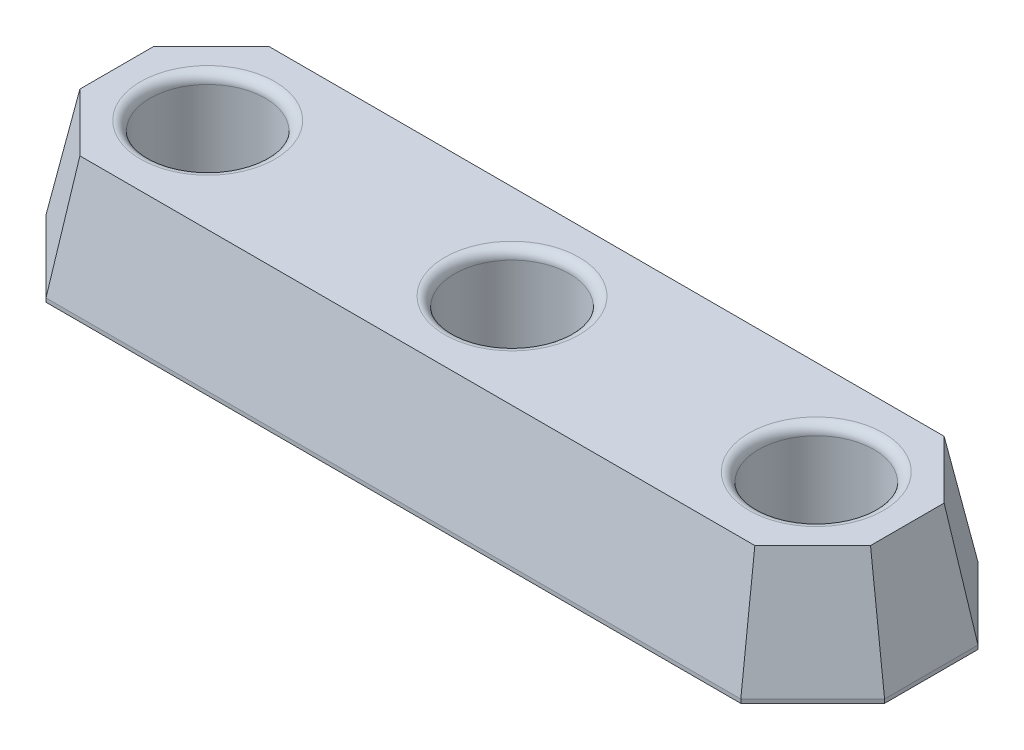
ISO-10303-21;
HEADER;
FILE_DESCRIPTION(('STEP AP214'),'2;1');
FILE_NAME('part.step','',(''),(''),'','','');
FILE_SCHEMA(('AUTOMOTIVE_DESIGN { 1 0 10303 214 1 1 1 1 }'));
ENDSEC;
DATA;
#1=APPLICATION_CONTEXT('core data for automotive mechanical design processes');
#2=APPLICATION_PROTOCOL_DEFINITION('international standard','automotive_design',2000,#1);
#3=PRODUCT_CONTEXT('',#1,'mechanical');
#4=PRODUCT('Part','Part','',(#3));
#5=PRODUCT_RELATED_PRODUCT_CATEGORY('part','',(#4));
#6=PRODUCT_DEFINITION_FORMATION('','',#4);
#7=PRODUCT_DEFINITION_CONTEXT('part definition',#1,'design');
#8=PRODUCT_DEFINITION('design','',#6,#7);
#9=PRODUCT_DEFINITION_SHAPE('','',#8);
#10=(LENGTH_UNIT() NAMED_UNIT(*) SI_UNIT(.MILLI.,.METRE.));
#11=(NAMED_UNIT(*) PLANE_ANGLE_UNIT() SI_UNIT($,.RADIAN.));
#12=(NAMED_UNIT(*) SI_UNIT($,.STERADIAN.) SOLID_ANGLE_UNIT());
#13=UNCERTAINTY_MEASURE_WITH_UNIT(LENGTH_MEASURE(1.E-05),#10,'distance_accuracy_value','');
#14=(GEOMETRIC_REPRESENTATION_CONTEXT(3) GLOBAL_UNCERTAINTY_ASSIGNED_CONTEXT((#13)) GLOBAL_UNIT_ASSIGNED_CONTEXT((#10,
#11,#12)) REPRESENTATION_CONTEXT('',''));
#15=CARTESIAN_POINT('',(0.,0.,0.));
#16=DIRECTION('',(0.,0.,1.));
#17=DIRECTION('',(1.,0.,0.));
#18=AXIS2_PLACEMENT_3D('',#15,#16,#17);
#19=CARTESIAN_POINT('',(0.,5.,0.));
#20=DIRECTION('',(0.,-1.,0.));
#21=DIRECTION('',(0.,0.,-1.));
#22=AXIS2_PLACEMENT_3D('',#19,#20,#21);
#23=PLANE('',#22);
#24=CARTESIAN_POINT('',(4.8,5.,-4.95));
#25=DIRECTION('',(0.,-1.,0.));
#26=DIRECTION('',(0.,0.,-1.));
#27=AXIS2_PLACEMENT_3D('',#24,#25,#26);
#28=CIRCLE('',#27,2.80416305603426);
#29=CARTESIAN_POINT('',(4.8,5.,-7.75416305603426));
#30=VERTEX_POINT('',#29);
#31=EDGE_CURVE('E11',#30,#30,#28,.T.);
#32=ORIENTED_EDGE('',*,*,#31,.T.);
#33=EDGE_LOOP('',(#32));
#34=FACE_BOUND('',#33,.T.);
#35=CARTESIAN_POINT('',(17.5,5.,-4.95));
#36=DIRECTION('',(0.,-1.,0.));
#37=DIRECTION('',(0.,0.,-1.));
#38=AXIS2_PLACEMENT_3D('',#35,#36,#37);
#39=CIRCLE('',#38,2.80416305603426);
#40=CARTESIAN_POINT('',(17.5,5.,-7.75416305603426));
#41=VERTEX_POINT('',#40);
#42=EDGE_CURVE('E43',#41,#41,#39,.T.);
#43=ORIENTED_EDGE('',*,*,#42,.T.);
#44=EDGE_LOOP('',(#43));
#45=FACE_BOUND('',#44,.T.);
#46=CARTESIAN_POINT('',(30.2,5.,-4.95));
#47=DIRECTION('',(0.,-1.,0.));
#48=DIRECTION('',(0.,0.,-1.));
#49=AXIS2_PLACEMENT_3D('',#46,#47,#48);
#50=CIRCLE('',#49,2.80416305603426);
#51=CARTESIAN_POINT('',(30.2,5.,-7.75416305603426));
#52=VERTEX_POINT('',#51);
#53=EDGE_CURVE('E258',#52,#52,#50,.T.);
#54=ORIENTED_EDGE('',*,*,#53,.T.);
#55=EDGE_LOOP('',(#54));
#56=FACE_BOUND('',#55,.T.);
#57=DIRECTION('',(0.,0.,-1.));
#58=VECTOR('',#57,1.);
#59=CARTESIAN_POINT('',(34.,5.,0.));
#60=LINE('',#59,#58);
#61=CARTESIAN_POINT('',(34.,5.,-3.4142135623731));
#62=VERTEX_POINT('',#61);
#63=CARTESIAN_POINT('',(34.,5.,-6.4857864376269));
#64=VERTEX_POINT('',#63);
#65=EDGE_CURVE('E190',#62,#64,#60,.T.);
#66=ORIENTED_EDGE('',*,*,#65,.T.);
#67=DIRECTION('',(-0.707106781186545,0.,-0.70710678118655));
#68=VECTOR('',#67,1.);
#69=CARTESIAN_POINT('',(31.2928932188135,5.,-9.19289321881346));
#70=LINE('',#69,#68);
#71=CARTESIAN_POINT('',(31.5857864376269,5.,-8.9));
#72=VERTEX_POINT('',#71);
#73=EDGE_CURVE('E192',#64,#72,#70,.T.);
#74=ORIENTED_EDGE('',*,*,#73,.T.);
#75=DIRECTION('',(-1.,0.,0.));
#76=VECTOR('',#75,1.);
#77=CARTESIAN_POINT('',(0.,5.,-8.9));
#78=LINE('',#77,#76);
#79=CARTESIAN_POINT('',(3.4142135623731,5.,-8.9));
#80=VERTEX_POINT('',#79);
#81=EDGE_CURVE('E178',#72,#80,#78,.T.);
#82=ORIENTED_EDGE('',*,*,#81,.T.);
#83=DIRECTION('',(-0.707106781186549,0.,0.707106781186546));
#84=VECTOR('',#83,1.);
#85=CARTESIAN_POINT('',(0.707106781186545,5.,-6.19289321881345));
#86=LINE('',#85,#84);
#87=CARTESIAN_POINT('',(0.999999999999999,5.,-6.4857864376269));
#88=VERTEX_POINT('',#87);
#89=EDGE_CURVE('E180',#80,#88,#86,.T.);
#90=ORIENTED_EDGE('',*,*,#89,.T.);
#91=DIRECTION('',(0.,0.,1.));
#92=VECTOR('',#91,1.);
#93=CARTESIAN_POINT('',(0.999999999999999,5.,0.));
#94=LINE('',#93,#92);
#95=CARTESIAN_POINT('',(0.999999999999999,5.,-3.4142135623731));
#96=VERTEX_POINT('',#95);
#97=EDGE_CURVE('E182',#88,#96,#94,.T.);
#98=ORIENTED_EDGE('',*,*,#97,.T.);
#99=DIRECTION('',(0.707106781186546,0.,0.707106781186549));
#100=VECTOR('',#99,1.);
#101=CARTESIAN_POINT('',(3.70710678118655,5.,-0.707106781186546));
#102=LINE('',#101,#100);
#103=CARTESIAN_POINT('',(3.4142135623731,5.,-0.999999999999999));
#104=VERTEX_POINT('',#103);
#105=EDGE_CURVE('E184',#96,#104,#102,.T.);
#106=ORIENTED_EDGE('',*,*,#105,.T.);
#107=DIRECTION('',(1.,0.,0.));
#108=VECTOR('',#107,1.);
#109=CARTESIAN_POINT('',(0.,5.,-0.999999999999999));
#110=LINE('',#109,#108);
#111=CARTESIAN_POINT('',(31.5857864376269,5.,-0.999999999999999));
#112=VERTEX_POINT('',#111);
#113=EDGE_CURVE('E186',#104,#112,#110,.T.);
#114=ORIENTED_EDGE('',*,*,#113,.T.);
#115=DIRECTION('',(0.707106781186549,0.,-0.707106781186546));
#116=VECTOR('',#115,1.);
#117=CARTESIAN_POINT('',(34.2928932188135,5.,-3.70710678118655));
#118=LINE('',#117,#116);
#119=EDGE_CURVE('E188',#112,#62,#118,.T.);
#120=ORIENTED_EDGE('',*,*,#119,.T.);
#121=EDGE_LOOP('',(#66,#74,#82,#90,#98,#106,#114,#120));
#122=FACE_BOUND('',#121,.T.);
#123=ADVANCED_FACE('F35',(#34,#45,#56,#122),#23,.F.);
#124=CARTESIAN_POINT('',(0.,0.,0.));
#125=DIRECTION('',(0.,-1.,0.));
#126=DIRECTION('',(0.,0.,-1.));
#127=AXIS2_PLACEMENT_3D('',#124,#125,#126);
#128=PLANE('',#127);
#129=CARTESIAN_POINT('',(30.2,0.,-4.95));
#130=DIRECTION('',(0.,-1.,0.));
#131=DIRECTION('',(0.,0.,-1.));
#132=AXIS2_PLACEMENT_3D('',#129,#130,#131);
#133=CIRCLE('',#132,2.80416305603426);
#134=CARTESIAN_POINT('',(30.2,0.,-7.75416305603426));
#135=VERTEX_POINT('',#134);
#136=EDGE_CURVE('E237',#135,#135,#133,.F.);
#137=ORIENTED_EDGE('',*,*,#136,.T.);
#138=EDGE_LOOP('',(#137));
#139=FACE_BOUND('',#138,.T.);
#140=CARTESIAN_POINT('',(17.5,0.,-4.95));
#141=DIRECTION('',(0.,-1.,0.));
#142=DIRECTION('',(0.,0.,-1.));
#143=AXIS2_PLACEMENT_3D('',#140,#141,#142);
#144=CIRCLE('',#143,2.80416305603426);
#145=CARTESIAN_POINT('',(17.5,0.,-7.75416305603426));
#146=VERTEX_POINT('',#145);
#147=EDGE_CURVE('E234',#146,#146,#144,.F.);
#148=ORIENTED_EDGE('',*,*,#147,.T.);
#149=EDGE_LOOP('',(#148));
#150=FACE_BOUND('',#149,.T.);
#151=CARTESIAN_POINT('',(4.8,0.,-4.95));
#152=DIRECTION('',(0.,-1.,0.));
#153=DIRECTION('',(0.,0.,-1.));
#154=AXIS2_PLACEMENT_3D('',#151,#152,#153);
#155=CIRCLE('',#154,2.80416305603426);
#156=CARTESIAN_POINT('',(4.8,0.,-7.75416305603426));
#157=VERTEX_POINT('',#156);
#158=EDGE_CURVE('E209',#157,#157,#155,.F.);
#159=ORIENTED_EDGE('',*,*,#158,.T.);
#160=EDGE_LOOP('',(#159));
#161=FACE_BOUND('',#160,.T.);
#162=DIRECTION('',(0.,0.,-1.));
#163=VECTOR('',#162,1.);
#164=CARTESIAN_POINT('',(35.,0.,0.));
#165=LINE('',#164,#163);
#166=CARTESIAN_POINT('',(35.,0.,-3.00000000000001));
#167=VERTEX_POINT('',#166);
#168=CARTESIAN_POINT('',(35.,0.,-6.89999999999999));
#169=VERTEX_POINT('',#168);
#170=EDGE_CURVE('E131',#167,#169,#165,.T.);
#171=ORIENTED_EDGE('',*,*,#170,.F.);
#172=DIRECTION('',(0.707106781186549,0.,-0.707106781186546));
#173=VECTOR('',#172,1.);
#174=CARTESIAN_POINT('',(15.9999999999999,0.,16.));
#175=LINE('',#174,#173);
#176=CARTESIAN_POINT('',(32.,0.,0.));
#177=VERTEX_POINT('',#176);
#178=EDGE_CURVE('E141',#167,#177,#175,.F.);
#179=ORIENTED_EDGE('',*,*,#178,.T.);
#180=DIRECTION('',(1.,0.,0.));
#181=VECTOR('',#180,1.);
#182=CARTESIAN_POINT('',(0.,0.,0.));
#183=LINE('',#182,#181);
#184=CARTESIAN_POINT('',(3.,0.,0.));
#185=VERTEX_POINT('',#184);
#186=EDGE_CURVE('E155',#185,#177,#183,.T.);
#187=ORIENTED_EDGE('',*,*,#186,.F.);
#188=DIRECTION('',(0.707106781186546,0.,0.707106781186549));
#189=VECTOR('',#188,1.);
#190=CARTESIAN_POINT('',(1.50000000000001,0.,-1.5));
#191=LINE('',#190,#189);
#192=CARTESIAN_POINT('',(0.,0.,-3.00000000000001));
#193=VERTEX_POINT('',#192);
#194=EDGE_CURVE('E137',#185,#193,#191,.F.);
#195=ORIENTED_EDGE('',*,*,#194,.T.);
#196=DIRECTION('',(0.,0.,1.));
#197=VECTOR('',#196,1.);
#198=CARTESIAN_POINT('',(0.,0.,0.));
#199=LINE('',#198,#197);
#200=CARTESIAN_POINT('',(0.,0.,-6.9));
#201=VERTEX_POINT('',#200);
#202=EDGE_CURVE('E159',#201,#193,#199,.T.);
#203=ORIENTED_EDGE('',*,*,#202,.F.);
#204=DIRECTION('',(-0.707106781186549,0.,0.707106781186546));
#205=VECTOR('',#204,1.);
#206=CARTESIAN_POINT('',(-3.45,0.,-3.45000000000001));
#207=LINE('',#206,#205);
#208=CARTESIAN_POINT('',(3.00000000000001,0.,-9.9));
#209=VERTEX_POINT('',#208);
#210=EDGE_CURVE('E165',#201,#209,#207,.F.);
#211=ORIENTED_EDGE('',*,*,#210,.T.);
#212=DIRECTION('',(-1.,0.,0.));
#213=VECTOR('',#212,1.);
#214=CARTESIAN_POINT('',(0.,0.,-9.9));
#215=LINE('',#214,#213);
#216=CARTESIAN_POINT('',(32.,0.,-9.9));
#217=VERTEX_POINT('',#216);
#218=EDGE_CURVE('E154',#217,#209,#215,.T.);
#219=ORIENTED_EDGE('',*,*,#218,.F.);
#220=DIRECTION('',(-0.707106781186545,0.,-0.70710678118655));
#221=VECTOR('',#220,1.);
#222=CARTESIAN_POINT('',(20.9500000000001,0.,-20.95));
#223=LINE('',#222,#221);
#224=EDGE_CURVE('E149',#217,#169,#223,.F.);
#225=ORIENTED_EDGE('',*,*,#224,.T.);
#226=EDGE_LOOP('',(#171,#179,#187,#195,#203,#211,#219,#225));
#227=FACE_BOUND('',#226,.T.);
#228=ADVANCED_FACE('F151',(#139,#150,#161,#227),#128,.T.);
#229=CARTESIAN_POINT('',(0.,5.,0.));
#230=DIRECTION('',(1.,0.,0.));
#231=DIRECTION('',(0.,0.,-1.));
#232=AXIS2_PLACEMENT_3D('',#229,#230,#231);
#233=PLANE('',#232);
#234=DIRECTION('',(0.,1.,0.));
#235=VECTOR('',#234,1.);
#236=CARTESIAN_POINT('',(0.,5.,-3.00000000000001));
#237=LINE('',#236,#235);
#238=CARTESIAN_POINT('',(0.,0.159999999999915,-3.00000000000001));
#239=VERTEX_POINT('',#238);
#240=EDGE_CURVE('E174',#193,#239,#237,.T.);
#241=ORIENTED_EDGE('',*,*,#240,.T.);
#242=DIRECTION('',(0.,0.,-1.));
#243=VECTOR('',#242,1.);
#244=CARTESIAN_POINT('',(0.,0.159999999999915,0.));
#245=LINE('',#244,#243);
#246=CARTESIAN_POINT('',(0.,0.159999999999915,-6.9));
#247=VERTEX_POINT('',#246);
#248=EDGE_CURVE('E58',#239,#247,#245,.T.);
#249=ORIENTED_EDGE('',*,*,#248,.T.);
#250=DIRECTION('',(0.,-1.,0.));
#251=VECTOR('',#250,1.);
#252=CARTESIAN_POINT('',(0.,5.,-6.9));
#253=LINE('',#252,#251);
#254=EDGE_CURVE('E176',#247,#201,#253,.T.);
#255=ORIENTED_EDGE('',*,*,#254,.T.);
#256=ORIENTED_EDGE('',*,*,#202,.T.);
#257=EDGE_LOOP('',(#241,#249,#255,#256));
#258=FACE_BOUND('',#257,.T.);
#259=ADVANCED_FACE('F292',(#258),#233,.F.);
#260=CARTESIAN_POINT('',(0.,5.,0.));
#261=DIRECTION('',(0.,0.,-1.));
#262=DIRECTION('',(-1.,0.,0.));
#263=AXIS2_PLACEMENT_3D('',#260,#261,#262);
#264=PLANE('',#263);
#265=DIRECTION('',(0.,1.,0.));
#266=VECTOR('',#265,1.);
#267=CARTESIAN_POINT('',(32.,5.,0.));
#268=LINE('',#267,#266);
#269=CARTESIAN_POINT('',(32.,0.159999999999915,0.));
#270=VERTEX_POINT('',#269);
#271=EDGE_CURVE('E144',#177,#270,#268,.T.);
#272=ORIENTED_EDGE('',*,*,#271,.T.);
#273=DIRECTION('',(-1.,0.,0.));
#274=VECTOR('',#273,1.);
#275=CARTESIAN_POINT('',(0.,0.159999999999915,0.));
#276=LINE('',#275,#274);
#277=CARTESIAN_POINT('',(3.,0.159999999999914,0.));
#278=VERTEX_POINT('',#277);
#279=EDGE_CURVE('E201',#270,#278,#276,.T.);
#280=ORIENTED_EDGE('',*,*,#279,.T.);
#281=DIRECTION('',(0.,-1.,0.));
#282=VECTOR('',#281,1.);
#283=CARTESIAN_POINT('',(3.,5.,0.));
#284=LINE('',#283,#282);
#285=EDGE_CURVE('E148',#278,#185,#284,.T.);
#286=ORIENTED_EDGE('',*,*,#285,.T.);
#287=ORIENTED_EDGE('',*,*,#186,.T.);
#288=EDGE_LOOP('',(#272,#280,#286,#287));
#289=FACE_BOUND('',#288,.T.);
#290=ADVANCED_FACE('F301',(#289),#264,.F.);
#291=CARTESIAN_POINT('',(35.,5.,0.));
#292=DIRECTION('',(-1.,0.,0.));
#293=DIRECTION('',(0.,0.,1.));
#294=AXIS2_PLACEMENT_3D('',#291,#292,#293);
#295=PLANE('',#294);
#296=DIRECTION('',(0.,1.,0.));
#297=VECTOR('',#296,1.);
#298=CARTESIAN_POINT('',(35.,5.,-6.9));
#299=LINE('',#298,#297);
#300=CARTESIAN_POINT('',(35.,0.159999999999913,-6.9));
#301=VERTEX_POINT('',#300);
#302=EDGE_CURVE('E138',#169,#301,#299,.T.);
#303=ORIENTED_EDGE('',*,*,#302,.T.);
#304=DIRECTION('',(0.,0.,1.));
#305=VECTOR('',#304,1.);
#306=CARTESIAN_POINT('',(35.,0.159999999999913,0.));
#307=LINE('',#306,#305);
#308=CARTESIAN_POINT('',(35.,0.159999999999931,-3.00000000000001));
#309=VERTEX_POINT('',#308);
#310=EDGE_CURVE('E134',#301,#309,#307,.T.);
#311=ORIENTED_EDGE('',*,*,#310,.T.);
#312=DIRECTION('',(0.,-1.,0.));
#313=VECTOR('',#312,1.);
#314=CARTESIAN_POINT('',(35.,5.,-3.00000000000001));
#315=LINE('',#314,#313);
#316=EDGE_CURVE('E126',#309,#167,#315,.T.);
#317=ORIENTED_EDGE('',*,*,#316,.T.);
#318=ORIENTED_EDGE('',*,*,#170,.T.);
#319=EDGE_LOOP('',(#303,#311,#317,#318));
#320=FACE_BOUND('',#319,.T.);
#321=ADVANCED_FACE('F129',(#320),#295,.F.);
#322=CARTESIAN_POINT('',(0.,5.,-9.9));
#323=DIRECTION('',(0.,0.,1.));
#324=DIRECTION('',(1.,0.,0.));
#325=AXIS2_PLACEMENT_3D('',#322,#323,#324);
#326=PLANE('',#325);
#327=DIRECTION('',(0.,1.,0.));
#328=VECTOR('',#327,1.);
#329=CARTESIAN_POINT('',(3.00000000000001,5.,-9.9));
#330=LINE('',#329,#328);
#331=CARTESIAN_POINT('',(3.00000000000001,0.159999999999915,-9.9));
#332=VERTEX_POINT('',#331);
#333=EDGE_CURVE('E170',#209,#332,#330,.T.);
#334=ORIENTED_EDGE('',*,*,#333,.T.);
#335=DIRECTION('',(1.,0.,0.));
#336=VECTOR('',#335,1.);
#337=CARTESIAN_POINT('',(0.,0.159999999999915,-9.9));
#338=LINE('',#337,#336);
#339=CARTESIAN_POINT('',(32.,0.159999999999915,-9.9));
#340=VERTEX_POINT('',#339);
#341=EDGE_CURVE('E207',#332,#340,#338,.T.);
#342=ORIENTED_EDGE('',*,*,#341,.T.);
#343=DIRECTION('',(0.,-1.,0.));
#344=VECTOR('',#343,1.);
#345=CARTESIAN_POINT('',(32.,5.,-9.9));
#346=LINE('',#345,#344);
#347=EDGE_CURVE('E172',#340,#217,#346,.T.);
#348=ORIENTED_EDGE('',*,*,#347,.T.);
#349=ORIENTED_EDGE('',*,*,#218,.T.);
#350=EDGE_LOOP('',(#334,#342,#348,#349));
#351=FACE_BOUND('',#350,.T.);
#352=ADVANCED_FACE('F283',(#351),#326,.F.);
#353=CARTESIAN_POINT('',(4.8,5.,-4.95));
#354=DIRECTION('',(0.,-1.,0.));
#355=DIRECTION('',(0.,0.,-1.));
#356=AXIS2_PLACEMENT_3D('',#353,#354,#355);
#357=CYLINDRICAL_SURFACE('',#356,2.40416305603426);
#358=CARTESIAN_POINT('',(4.8,0.4,-4.95));
#359=DIRECTION('',(0.,-1.,0.));
#360=DIRECTION('',(0.,0.,-1.));
#361=AXIS2_PLACEMENT_3D('',#358,#359,#360);
#362=CIRCLE('',#361,2.40416305603426);
#363=CARTESIAN_POINT('',(4.8,0.4,-7.35416305603426));
#364=VERTEX_POINT('',#363);
#365=EDGE_CURVE('E255',#364,#364,#362,.T.);
#366=ORIENTED_EDGE('',*,*,#365,.T.);
#367=EDGE_LOOP('',(#366));
#368=FACE_BOUND('',#367,.T.);
#369=CARTESIAN_POINT('',(4.8,4.6,-4.95));
#370=DIRECTION('',(0.,-1.,0.));
#371=DIRECTION('',(0.,0.,-1.));
#372=AXIS2_PLACEMENT_3D('',#369,#370,#371);
#373=CIRCLE('',#372,2.40416305603426);
#374=CARTESIAN_POINT('',(4.8,4.6,-7.35416305603426));
#375=VERTEX_POINT('',#374);
#376=EDGE_CURVE('E252',#375,#375,#373,.F.);
#377=ORIENTED_EDGE('',*,*,#376,.T.);
#378=EDGE_LOOP('',(#377));
#379=FACE_BOUND('',#378,.T.);
#380=ADVANCED_FACE('F274',(#368,#379),#357,.F.);
#381=CARTESIAN_POINT('',(17.5,5.,-4.95));
#382=DIRECTION('',(0.,-1.,0.));
#383=DIRECTION('',(0.,0.,-1.));
#384=AXIS2_PLACEMENT_3D('',#381,#382,#383);
#385=CYLINDRICAL_SURFACE('',#384,2.40416305603426);
#386=CARTESIAN_POINT('',(17.5,0.4,-4.95));
#387=DIRECTION('',(0.,-1.,0.));
#388=DIRECTION('',(0.,0.,-1.));
#389=AXIS2_PLACEMENT_3D('',#386,#387,#388);
#390=CIRCLE('',#389,2.40416305603426);
#391=CARTESIAN_POINT('',(17.5,0.4,-7.35416305603426));
#392=VERTEX_POINT('',#391);
#393=EDGE_CURVE('E249',#392,#392,#390,.T.);
#394=ORIENTED_EDGE('',*,*,#393,.T.);
#395=EDGE_LOOP('',(#394));
#396=FACE_BOUND('',#395,.T.);
#397=CARTESIAN_POINT('',(17.5,4.6,-4.95));
#398=DIRECTION('',(0.,-1.,0.));
#399=DIRECTION('',(0.,0.,-1.));
#400=AXIS2_PLACEMENT_3D('',#397,#398,#399);
#401=CIRCLE('',#400,2.40416305603426);
#402=CARTESIAN_POINT('',(17.5,4.6,-7.35416305603426));
#403=VERTEX_POINT('',#402);
#404=EDGE_CURVE('E246',#403,#403,#401,.F.);
#405=ORIENTED_EDGE('',*,*,#404,.T.);
#406=EDGE_LOOP('',(#405));
#407=FACE_BOUND('',#406,.T.);
#408=ADVANCED_FACE('F271',(#396,#407),#385,.F.);
#409=CARTESIAN_POINT('',(30.2,5.,-4.95));
#410=DIRECTION('',(0.,-1.,0.));
#411=DIRECTION('',(0.,0.,-1.));
#412=AXIS2_PLACEMENT_3D('',#409,#410,#411);
#413=CYLINDRICAL_SURFACE('',#412,2.40416305603426);
#414=CARTESIAN_POINT('',(30.2,0.4,-4.95));
#415=DIRECTION('',(0.,-1.,0.));
#416=DIRECTION('',(0.,0.,-1.));
#417=AXIS2_PLACEMENT_3D('',#414,#415,#416);
#418=CIRCLE('',#417,2.40416305603426);
#419=CARTESIAN_POINT('',(30.2,0.4,-7.35416305603426));
#420=VERTEX_POINT('',#419);
#421=EDGE_CURVE('E243',#420,#420,#418,.T.);
#422=ORIENTED_EDGE('',*,*,#421,.T.);
#423=EDGE_LOOP('',(#422));
#424=FACE_BOUND('',#423,.T.);
#425=CARTESIAN_POINT('',(30.2,4.6,-4.95));
#426=DIRECTION('',(0.,-1.,0.));
#427=DIRECTION('',(0.,0.,-1.));
#428=AXIS2_PLACEMENT_3D('',#425,#426,#427);
#429=CIRCLE('',#428,2.40416305603426);
#430=CARTESIAN_POINT('',(30.2,4.6,-7.35416305603426));
#431=VERTEX_POINT('',#430);
#432=EDGE_CURVE('E240',#431,#431,#429,.F.);
#433=ORIENTED_EDGE('',*,*,#432,.T.);
#434=EDGE_LOOP('',(#433));
#435=FACE_BOUND('',#434,.T.);
#436=ADVANCED_FACE('F273',(#424,#435),#413,.F.);
#437=CARTESIAN_POINT('',(35.,5.,-3.00000000000001));
#438=DIRECTION('',(-0.707106781186546,0.,-0.707106781186549));
#439=DIRECTION('',(0.,-1.,0.));
#440=AXIS2_PLACEMENT_3D('',#437,#438,#439);
#441=PLANE('',#440);
#442=ORIENTED_EDGE('',*,*,#316,.F.);
#443=DIRECTION('',(0.707106781186549,0.,-0.707106781186546));
#444=VECTOR('',#443,1.);
#445=CARTESIAN_POINT('',(32.,0.159999999999931,0.));
#446=LINE('',#445,#444);
#447=EDGE_CURVE('E199',#309,#270,#446,.F.);
#448=ORIENTED_EDGE('',*,*,#447,.T.);
#449=ORIENTED_EDGE('',*,*,#271,.F.);
#450=ORIENTED_EDGE('',*,*,#178,.F.);
#451=EDGE_LOOP('',(#442,#448,#449,#450));
#452=FACE_BOUND('',#451,.T.);
#453=ADVANCED_FACE('F142',(#452),#441,.F.);
#454=CARTESIAN_POINT('',(32.,5.,-9.9));
#455=DIRECTION('',(-0.70710678118655,0.,0.707106781186545));
#456=DIRECTION('',(0.,-1.,0.));
#457=AXIS2_PLACEMENT_3D('',#454,#455,#456);
#458=PLANE('',#457);
#459=ORIENTED_EDGE('',*,*,#347,.F.);
#460=DIRECTION('',(-0.707106781186545,0.,-0.70710678118655));
#461=VECTOR('',#460,1.);
#462=CARTESIAN_POINT('',(35.,0.159999999999921,-6.9));
#463=LINE('',#462,#461);
#464=EDGE_CURVE('E195',#340,#301,#463,.F.);
#465=ORIENTED_EDGE('',*,*,#464,.T.);
#466=ORIENTED_EDGE('',*,*,#302,.F.);
#467=ORIENTED_EDGE('',*,*,#224,.F.);
#468=EDGE_LOOP('',(#459,#465,#466,#467));
#469=FACE_BOUND('',#468,.T.);
#470=ADVANCED_FACE('F313',(#469),#458,.F.);
#471=CARTESIAN_POINT('',(0.,5.,-6.9));
#472=DIRECTION('',(0.707106781186546,0.,0.707106781186549));
#473=DIRECTION('',(0.,-1.,0.));
#474=AXIS2_PLACEMENT_3D('',#471,#472,#473);
#475=PLANE('',#474);
#476=ORIENTED_EDGE('',*,*,#254,.F.);
#477=DIRECTION('',(-0.707106781186549,0.,0.707106781186546));
#478=VECTOR('',#477,1.);
#479=CARTESIAN_POINT('',(3.00000000000001,0.159999999999916,-9.9));
#480=LINE('',#479,#478);
#481=EDGE_CURVE('E50',#247,#332,#480,.F.);
#482=ORIENTED_EDGE('',*,*,#481,.T.);
#483=ORIENTED_EDGE('',*,*,#333,.F.);
#484=ORIENTED_EDGE('',*,*,#210,.F.);
#485=EDGE_LOOP('',(#476,#482,#483,#484));
#486=FACE_BOUND('',#485,.T.);
#487=ADVANCED_FACE('F319',(#486),#475,.F.);
#488=CARTESIAN_POINT('',(3.,5.,0.));
#489=DIRECTION('',(0.707106781186549,0.,-0.707106781186546));
#490=DIRECTION('',(0.,-1.,0.));
#491=AXIS2_PLACEMENT_3D('',#488,#489,#490);
#492=PLANE('',#491);
#493=ORIENTED_EDGE('',*,*,#285,.F.);
#494=DIRECTION('',(0.707106781186546,0.,0.707106781186549));
#495=VECTOR('',#494,1.);
#496=CARTESIAN_POINT('',(0.,0.159999999999914,-3.00000000000001));
#497=LINE('',#496,#495);
#498=EDGE_CURVE('E203',#278,#239,#497,.F.);
#499=ORIENTED_EDGE('',*,*,#498,.T.);
#500=ORIENTED_EDGE('',*,*,#240,.F.);
#501=ORIENTED_EDGE('',*,*,#194,.F.);
#502=EDGE_LOOP('',(#493,#499,#500,#501));
#503=FACE_BOUND('',#502,.T.);
#504=ADVANCED_FACE('F326',(#503),#492,.F.);
#505=CARTESIAN_POINT('',(2.20710678118655,5.,-2.20710678118655));
#506=DIRECTION('',(0.692480811131171,-0.202337965864629,-0.692480811131168));
#507=DIRECTION('',(0.707106781186546,0.,0.707106781186549));
#508=AXIS2_PLACEMENT_3D('',#505,#506,#507);
#509=PLANE('',#508);
#510=DIRECTION('',(0.201631046069272,0.975894262975294,-0.0835183138773668));
#511=VECTOR('',#510,1.);
#512=CARTESIAN_POINT('',(0.942505036267975,4.721724375537,-3.39039836862715));
#513=LINE('',#512,#511);
#514=EDGE_CURVE('E226',#239,#96,#513,.T.);
#515=ORIENTED_EDGE('',*,*,#514,.F.);
#516=ORIENTED_EDGE('',*,*,#498,.F.);
#517=DIRECTION('',(0.0835183138773672,0.975894262975294,-0.201631046069272));
#518=VECTOR('',#517,1.);
#519=CARTESIAN_POINT('',(3.42612115924607,5.1391378122315,-1.02874748186601));
#520=LINE('',#519,#518);
#521=EDGE_CURVE('E229',#104,#278,#520,.F.);
#522=ORIENTED_EDGE('',*,*,#521,.F.);
#523=ORIENTED_EDGE('',*,*,#105,.F.);
#524=EDGE_LOOP('',(#515,#516,#522,#523));
#525=FACE_BOUND('',#524,.T.);
#526=ADVANCED_FACE('F332',(#525),#509,.F.);
#527=CARTESIAN_POINT('',(0.,5.,-0.999999999999999));
#528=DIRECTION('',(0.,-0.202337965864629,-0.979315754784821));
#529=DIRECTION('',(1.,0.,0.));
#530=AXIS2_PLACEMENT_3D('',#527,#528,#529);
#531=PLANE('',#530);
#532=ORIENTED_EDGE('',*,*,#521,.T.);
#533=ORIENTED_EDGE('',*,*,#279,.F.);
#534=DIRECTION('',(-0.083518313877367,0.975894262975294,-0.201631046069272));
#535=VECTOR('',#534,1.);
#536=CARTESIAN_POINT('',(31.3654658250207,7.57440089335723,-1.53190101102421));
#537=LINE('',#536,#535);
#538=EDGE_CURVE('E223',#112,#270,#537,.F.);
#539=ORIENTED_EDGE('',*,*,#538,.F.);
#540=ORIENTED_EDGE('',*,*,#113,.F.);
#541=EDGE_LOOP('',(#532,#533,#539,#540));
#542=FACE_BOUND('',#541,.T.);
#543=ADVANCED_FACE('F377',(#542),#531,.F.);
#544=CARTESIAN_POINT('',(0.999999999999999,5.,0.));
#545=DIRECTION('',(0.979315754784821,-0.202337965864629,0.));
#546=DIRECTION('',(0.,0.,1.));
#547=AXIS2_PLACEMENT_3D('',#544,#545,#546);
#548=PLANE('',#547);
#549=ORIENTED_EDGE('',*,*,#514,.T.);
#550=ORIENTED_EDGE('',*,*,#97,.F.);
#551=DIRECTION('',(0.201631046069272,0.975894262975294,0.0835183138773672));
#552=VECTOR('',#551,1.);
#553=CARTESIAN_POINT('',(0.910862272823541,4.56857340046593,-6.52270849314251));
#554=LINE('',#553,#552);
#555=EDGE_CURVE('E220',#247,#88,#554,.T.);
#556=ORIENTED_EDGE('',*,*,#555,.F.);
#557=ORIENTED_EDGE('',*,*,#248,.F.);
#558=EDGE_LOOP('',(#549,#550,#556,#557));
#559=FACE_BOUND('',#558,.T.);
#560=ADVANCED_FACE('F370',(#559),#548,.F.);
#561=CARTESIAN_POINT('',(15.2928932188134,5.,15.2928932188134));
#562=DIRECTION('',(-0.692480811131168,-0.202337965864629,-0.692480811131171));
#563=DIRECTION('',(0.707106781186549,0.,-0.707106781186546));
#564=AXIS2_PLACEMENT_3D('',#561,#562,#563);
#565=PLANE('',#564);
#566=ORIENTED_EDGE('',*,*,#538,.T.);
#567=ORIENTED_EDGE('',*,*,#447,.F.);
#568=DIRECTION('',(-0.201631046069272,0.975894262975294,-0.0835183138773671));
#569=VECTOR('',#568,1.);
#570=CARTESIAN_POINT('',(33.5544866275798,7.15628472251382,-3.59875124344812));
#571=LINE('',#570,#569);
#572=EDGE_CURVE('E217',#62,#309,#571,.F.);
#573=ORIENTED_EDGE('',*,*,#572,.F.);
#574=ORIENTED_EDGE('',*,*,#119,.F.);
#575=EDGE_LOOP('',(#566,#567,#573,#574));
#576=FACE_BOUND('',#575,.T.);
#577=ADVANCED_FACE('F363',(#576),#565,.F.);
#578=CARTESIAN_POINT('',(-2.74289321881345,5.,-2.74289321881346));
#579=DIRECTION('',(0.692480811131168,-0.202337965864629,0.692480811131171));
#580=DIRECTION('',(-0.707106781186549,0.,0.707106781186546));
#581=AXIS2_PLACEMENT_3D('',#578,#579,#580);
#582=PLANE('',#581);
#583=ORIENTED_EDGE('',*,*,#555,.T.);
#584=ORIENTED_EDGE('',*,*,#89,.F.);
#585=DIRECTION('',(0.0835183138773668,0.975894262975294,0.201631046069272));
#586=VECTOR('',#585,1.);
#587=CARTESIAN_POINT('',(3.39039836862715,4.721724375537,-8.95749496373203));
#588=LINE('',#587,#586);
#589=EDGE_CURVE('E214',#332,#80,#588,.T.);
#590=ORIENTED_EDGE('',*,*,#589,.F.);
#591=ORIENTED_EDGE('',*,*,#481,.F.);
#592=EDGE_LOOP('',(#583,#584,#590,#591));
#593=FACE_BOUND('',#592,.T.);
#594=ADVANCED_FACE('F356',(#593),#582,.F.);
#595=CARTESIAN_POINT('',(34.,5.,0.));
#596=DIRECTION('',(-0.979315754784821,-0.202337965864629,0.));
#597=DIRECTION('',(0.,0.,-1.));
#598=AXIS2_PLACEMENT_3D('',#595,#596,#597);
#599=PLANE('',#598);
#600=ORIENTED_EDGE('',*,*,#572,.T.);
#601=ORIENTED_EDGE('',*,*,#310,.F.);
#602=DIRECTION('',(-0.201631046069272,0.975894262975294,0.0835183138773668));
#603=VECTOR('',#602,1.);
#604=CARTESIAN_POINT('',(33.890780102301,5.52862430486329,-6.44054607471896));
#605=LINE('',#604,#603);
#606=EDGE_CURVE('E212',#64,#301,#605,.F.);
#607=ORIENTED_EDGE('',*,*,#606,.F.);
#608=ORIENTED_EDGE('',*,*,#65,.F.);
#609=EDGE_LOOP('',(#600,#601,#607,#608));
#610=FACE_BOUND('',#609,.T.);
#611=ADVANCED_FACE('F349',(#610),#599,.F.);
#612=CARTESIAN_POINT('',(0.,5.,-8.9));
#613=DIRECTION('',(0.,-0.202337965864629,0.979315754784821));
#614=DIRECTION('',(-1.,0.,0.));
#615=AXIS2_PLACEMENT_3D('',#612,#613,#614);
#616=PLANE('',#615);
#617=ORIENTED_EDGE('',*,*,#589,.T.);
#618=ORIENTED_EDGE('',*,*,#81,.F.);
#619=DIRECTION('',(0.0835183138773678,-0.975894262975294,-0.201631046069272));
#620=VECTOR('',#619,1.);
#621=CARTESIAN_POINT('',(31.3654658250207,7.57440089335726,-8.36809898897579));
#622=LINE('',#621,#620);
#623=EDGE_CURVE('E210',#340,#72,#622,.F.);
#624=ORIENTED_EDGE('',*,*,#623,.F.);
#625=ORIENTED_EDGE('',*,*,#341,.F.);
#626=EDGE_LOOP('',(#617,#618,#624,#625));
#627=FACE_BOUND('',#626,.T.);
#628=ADVANCED_FACE('F342',(#627),#616,.F.);
#629=CARTESIAN_POINT('',(20.2428932188135,5.,-20.2428932188134));
#630=DIRECTION('',(-0.692480811131171,-0.202337965864629,0.692480811131167));
#631=DIRECTION('',(-0.707106781186545,0.,-0.70710678118655));
#632=AXIS2_PLACEMENT_3D('',#629,#630,#631);
#633=PLANE('',#632);
#634=ORIENTED_EDGE('',*,*,#606,.T.);
#635=ORIENTED_EDGE('',*,*,#464,.F.);
#636=ORIENTED_EDGE('',*,*,#623,.T.);
#637=ORIENTED_EDGE('',*,*,#73,.F.);
#638=EDGE_LOOP('',(#634,#635,#636,#637));
#639=FACE_BOUND('',#638,.T.);
#640=ADVANCED_FACE('F335',(#639),#633,.F.);
#641=CARTESIAN_POINT('',(30.2,0.4,-4.95));
#642=DIRECTION('',(0.,-1.,0.));
#643=DIRECTION('',(0.,0.,-1.));
#644=AXIS2_PLACEMENT_3D('',#641,#642,#643);
#645=TOROIDAL_SURFACE('',#644,2.80416305603426,0.4);
#646=ORIENTED_EDGE('',*,*,#421,.F.);
#647=EDGE_LOOP('',(#646));
#648=FACE_BOUND('',#647,.T.);
#649=ORIENTED_EDGE('',*,*,#136,.F.);
#650=EDGE_LOOP('',(#649));
#651=FACE_BOUND('',#650,.T.);
#652=ADVANCED_FACE('F341',(#648,#651),#645,.T.);
#653=CARTESIAN_POINT('',(17.5,0.4,-4.95));
#654=DIRECTION('',(0.,-1.,0.));
#655=DIRECTION('',(0.,0.,-1.));
#656=AXIS2_PLACEMENT_3D('',#653,#654,#655);
#657=TOROIDAL_SURFACE('',#656,2.80416305603426,0.4);
#658=ORIENTED_EDGE('',*,*,#393,.F.);
#659=EDGE_LOOP('',(#658));
#660=FACE_BOUND('',#659,.T.);
#661=ORIENTED_EDGE('',*,*,#147,.F.);
#662=EDGE_LOOP('',(#661));
#663=FACE_BOUND('',#662,.T.);
#664=ADVANCED_FACE('F391',(#660,#663),#657,.T.);
#665=CARTESIAN_POINT('',(4.8,0.4,-4.95));
#666=DIRECTION('',(0.,-1.,0.));
#667=DIRECTION('',(0.,0.,-1.));
#668=AXIS2_PLACEMENT_3D('',#665,#666,#667);
#669=TOROIDAL_SURFACE('',#668,2.80416305603426,0.4);
#670=ORIENTED_EDGE('',*,*,#365,.F.);
#671=EDGE_LOOP('',(#670));
#672=FACE_BOUND('',#671,.T.);
#673=ORIENTED_EDGE('',*,*,#158,.F.);
#674=EDGE_LOOP('',(#673));
#675=FACE_BOUND('',#674,.T.);
#676=ADVANCED_FACE('F395',(#672,#675),#669,.T.);
#677=CARTESIAN_POINT('',(4.8,4.6,-4.95));
#678=DIRECTION('',(0.,-1.,0.));
#679=DIRECTION('',(0.,0.,-1.));
#680=AXIS2_PLACEMENT_3D('',#677,#678,#679);
#681=TOROIDAL_SURFACE('',#680,2.80416305603426,0.4);
#682=ORIENTED_EDGE('',*,*,#31,.F.);
#683=EDGE_LOOP('',(#682));
#684=FACE_BOUND('',#683,.T.);
#685=ORIENTED_EDGE('',*,*,#376,.F.);
#686=EDGE_LOOP('',(#685));
#687=FACE_BOUND('',#686,.T.);
#688=ADVANCED_FACE('F268',(#684,#687),#681,.T.);
#689=CARTESIAN_POINT('',(17.5,4.6,-4.95));
#690=DIRECTION('',(0.,-1.,0.));
#691=DIRECTION('',(0.,0.,-1.));
#692=AXIS2_PLACEMENT_3D('',#689,#690,#691);
#693=TOROIDAL_SURFACE('',#692,2.80416305603426,0.4);
#694=ORIENTED_EDGE('',*,*,#42,.F.);
#695=EDGE_LOOP('',(#694));
#696=FACE_BOUND('',#695,.T.);
#697=ORIENTED_EDGE('',*,*,#404,.F.);
#698=EDGE_LOOP('',(#697));
#699=FACE_BOUND('',#698,.T.);
#700=ADVANCED_FACE('F265',(#696,#699),#693,.T.);
#701=CARTESIAN_POINT('',(30.2,4.6,-4.95));
#702=DIRECTION('',(0.,-1.,0.));
#703=DIRECTION('',(0.,0.,-1.));
#704=AXIS2_PLACEMENT_3D('',#701,#702,#703);
#705=TOROIDAL_SURFACE('',#704,2.80416305603426,0.4);
#706=ORIENTED_EDGE('',*,*,#53,.F.);
#707=EDGE_LOOP('',(#706));
#708=FACE_BOUND('',#707,.T.);
#709=ORIENTED_EDGE('',*,*,#432,.F.);
#710=EDGE_LOOP('',(#709));
#711=FACE_BOUND('',#710,.T.);
#712=ADVANCED_FACE('F37',(#708,#711),#705,.T.);
#713=CLOSED_SHELL('',(#123,#228,#259,#290,#321,#352,#380,#408,#436,#453,#470,#487,#504,#526,
#543,#560,#577,#594,#611,#628,#640,#652,#664,#676,#688,#700,#712));
#714=MANIFOLD_SOLID_BREP('B2',#713);
#715=ADVANCED_BREP_SHAPE_REPRESENTATION('',(#18,#714),#14);
#716=SHAPE_DEFINITION_REPRESENTATION(#9,#715);
ENDSEC;
END-ISO-10303-21;
